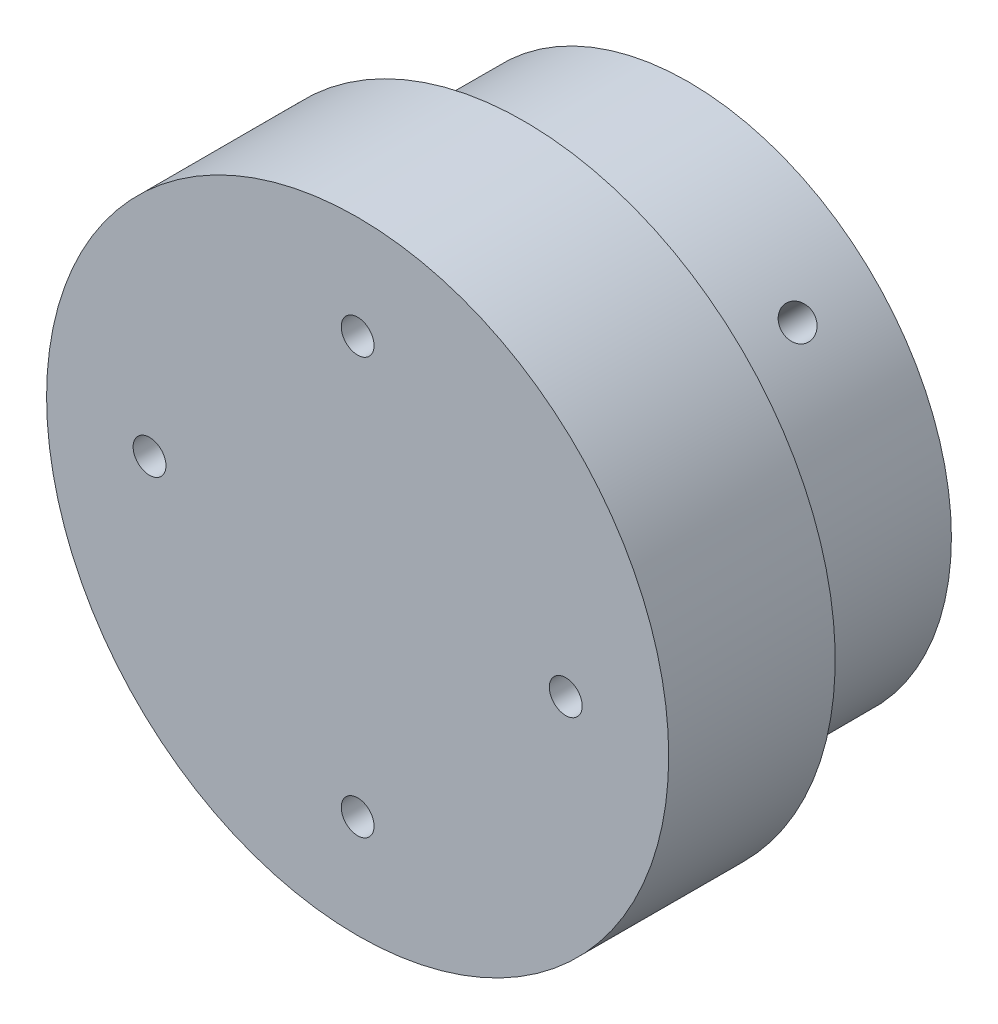
ISO-10303-21;
HEADER;
FILE_DESCRIPTION(('STEP AP214'),'2;1');
FILE_NAME('part.step','',(''),(''),'','','');
FILE_SCHEMA(('AUTOMOTIVE_DESIGN { 1 0 10303 214 1 1 1 1 }'));
ENDSEC;
DATA;
#1=APPLICATION_CONTEXT('core data for automotive mechanical design processes');
#2=APPLICATION_PROTOCOL_DEFINITION('international standard','automotive_design',2000,#1);
#3=PRODUCT_CONTEXT('',#1,'mechanical');
#4=PRODUCT('Part','Part','',(#3));
#5=PRODUCT_RELATED_PRODUCT_CATEGORY('part','',(#4));
#6=PRODUCT_DEFINITION_FORMATION('','',#4);
#7=PRODUCT_DEFINITION_CONTEXT('part definition',#1,'design');
#8=PRODUCT_DEFINITION('design','',#6,#7);
#9=PRODUCT_DEFINITION_SHAPE('','',#8);
#10=(LENGTH_UNIT() NAMED_UNIT(*) SI_UNIT(.MILLI.,.METRE.));
#11=(NAMED_UNIT(*) PLANE_ANGLE_UNIT() SI_UNIT($,.RADIAN.));
#12=(NAMED_UNIT(*) SI_UNIT($,.STERADIAN.) SOLID_ANGLE_UNIT());
#13=UNCERTAINTY_MEASURE_WITH_UNIT(LENGTH_MEASURE(1.E-05),#10,'distance_accuracy_value','');
#14=(GEOMETRIC_REPRESENTATION_CONTEXT(3) GLOBAL_UNCERTAINTY_ASSIGNED_CONTEXT((#13)) GLOBAL_UNIT_ASSIGNED_CONTEXT((#10,
#11,#12)) REPRESENTATION_CONTEXT('',''));
#15=CARTESIAN_POINT('',(0.,0.,0.));
#16=DIRECTION('',(0.,0.,1.));
#17=DIRECTION('',(1.,0.,0.));
#18=AXIS2_PLACEMENT_3D('',#15,#16,#17);
#19=CARTESIAN_POINT('',(-35.3482679915155,35.3482679915155,29.5));
#20=DIRECTION('',(0.707106781186547,-0.707106781186548,0.));
#21=DIRECTION('',(0.707106781186548,0.707106781186547,0.));
#22=AXIS2_PLACEMENT_3D('',#19,#20,#21);
#23=CYLINDRICAL_SURFACE('',#22,1.45);
#24=CARTESIAN_POINT('',(0.,0.,29.5));
#25=DIRECTION('',(0.,-1.,0.));
#26=DIRECTION('',(1.,0.,0.));
#27=AXIS2_PLACEMENT_3D('',#24,#25,#26);
#28=ELLIPSE('',#27,2.05060966544099,1.45);
#29=CARTESIAN_POINT('',(0.,0.,28.05));
#30=VERTEX_POINT('',#29);
#31=CARTESIAN_POINT('',(0.,0.,30.95));
#32=VERTEX_POINT('',#31);
#33=EDGE_CURVE('E11',#30,#32,#28,.F.);
#34=ORIENTED_EDGE('',*,*,#33,.F.);
#35=CARTESIAN_POINT('',(0.,0.,29.5));
#36=DIRECTION('',(1.,0.,0.));
#37=DIRECTION('',(0.,-1.,0.));
#38=AXIS2_PLACEMENT_3D('',#35,#36,#37);
#39=ELLIPSE('',#38,2.05060966544099,1.45);
#40=EDGE_CURVE('E56',#32,#30,#39,.F.);
#41=ORIENTED_EDGE('',*,*,#40,.F.);
#42=EDGE_LOOP('',(#34,#41));
#43=FACE_BOUND('',#42,.T.);
#44=CARTESIAN_POINT('',(-15.9213408530782,17.9719505185192,29.5));
#45=CARTESIAN_POINT('',(-15.9213438010672,17.9719484002794,29.4186325818246));
#46=CARTESIAN_POINT('',(-15.9264962267636,17.967387460958,29.3372080554519));
#47=CARTESIAN_POINT('',(-15.946952102721,17.949233922941,29.1766069473451));
#48=CARTESIAN_POINT('',(-15.962267395074,17.9356307879627,29.0974331005423));
#49=CARTESIAN_POINT('',(-16.0025350961888,17.8997121251281,28.9436829511586));
#50=CARTESIAN_POINT('',(-16.0274824500426,17.8774011670726,28.8691042608046));
#51=CARTESIAN_POINT('',(-16.0861869781197,17.8245964782,28.7266342596429));
#52=CARTESIAN_POINT('',(-16.1199421235813,17.7941046316999,28.6587414137907));
#53=CARTESIAN_POINT('',(-16.1952189946783,17.7256189298053,28.5314547893875));
#54=CARTESIAN_POINT('',(-16.2367503339505,17.6876157849923,28.4720716935363));
#55=CARTESIAN_POINT('',(-16.3262310506674,17.6050554563663,28.3635816052567));
#56=CARTESIAN_POINT('',(-16.3741806946131,17.5604980003974,28.3144750397479));
#57=CARTESIAN_POINT('',(-16.4750373146231,17.4659102678427,28.2278998278234));
#58=CARTESIAN_POINT('',(-16.5279479708209,17.4158759237599,28.1904399113545));
#59=CARTESIAN_POINT('',(-16.6370745670026,17.3116589738842,28.1282772682949));
#60=CARTESIAN_POINT('',(-16.693290473513,17.2574764101004,28.103574412533));
#61=CARTESIAN_POINT('',(-16.8072729074734,17.1464863438389,28.0676564564509));
#62=CARTESIAN_POINT('',(-16.8650374397458,17.0896821566872,28.0564247807902));
#63=CARTESIAN_POINT('',(-16.9804993843659,16.9749628155967,28.0477168301126));
#64=CARTESIAN_POINT('',(-17.0381967974215,16.9170476734911,28.0502404086663));
#65=CARTESIAN_POINT('',(-17.1518170307891,16.8018395328288,28.0689576432536));
#66=CARTESIAN_POINT('',(-17.2077420673121,16.7445458214039,28.0851334670956));
#67=CARTESIAN_POINT('',(-17.3163688673369,16.6321850576514,28.130668353174));
#68=CARTESIAN_POINT('',(-17.3690706127956,16.5771180177886,28.1600274891989));
#69=CARTESIAN_POINT('',(-17.4698936246552,16.4708315535866,28.2311158194772));
#70=CARTESIAN_POINT('',(-17.5180118684502,16.4196146728767,28.2728531029444));
#71=CARTESIAN_POINT('',(-17.6084019828673,16.3226431898506,28.3675070705062));
#72=CARTESIAN_POINT('',(-17.6506737922036,16.2768886447944,28.4204238717766));
#73=CARTESIAN_POINT('',(-17.728387969767,16.1922103398775,28.5360354914925));
#74=CARTESIAN_POINT('',(-17.7638193265244,16.1532976025101,28.5987457863907));
#75=CARTESIAN_POINT('',(-17.8269115180946,16.0836420467869,28.7321100289775));
#76=CARTESIAN_POINT('',(-17.8545723500283,16.052899231458,28.8027639796092));
#77=CARTESIAN_POINT('',(-17.9014677422684,16.0005872703053,28.950019738176));
#78=CARTESIAN_POINT('',(-17.9207018670189,15.9790185986721,29.0266218533163));
#79=CARTESIAN_POINT('',(-17.9502894963452,15.9457739397189,29.1835950011974));
#80=CARTESIAN_POINT('',(-17.9606430984301,15.9340978437774,29.2639659925452));
#81=CARTESIAN_POINT('',(-17.9722189128575,15.921040323758,29.4260595835387));
#82=CARTESIAN_POINT('',(-17.9734555183299,15.9196426729638,29.507779848526));
#83=CARTESIAN_POINT('',(-17.9668066294231,15.9271461253071,29.6703716839974));
#84=CARTESIAN_POINT('',(-17.9589211793165,15.9360471784613,29.7512432585985));
#85=CARTESIAN_POINT('',(-17.9342210822051,15.963839006287,29.9097809135391));
#86=CARTESIAN_POINT('',(-17.9174130833934,15.9827223431127,29.9874493341754));
#87=CARTESIAN_POINT('',(-17.875264318905,16.0298477565126,30.1374481678848));
#88=CARTESIAN_POINT('',(-17.8499234809842,16.0580899123242,30.2097785357563));
#89=CARTESIAN_POINT('',(-17.7912691398583,16.1230503494629,30.3471475532723));
#90=CARTESIAN_POINT('',(-17.7579456866175,16.1597792071108,30.4121769527669));
#91=CARTESIAN_POINT('',(-17.6841423442399,16.2405108535972,30.5330049293201));
#92=CARTESIAN_POINT('',(-17.6436623895195,16.284513709096,30.5888034217756));
#93=CARTESIAN_POINT('',(-17.5564834370166,16.3784643207338,30.689658734264));
#94=CARTESIAN_POINT('',(-17.5097764522372,16.4284197028908,30.7347015480797));
#95=CARTESIAN_POINT('',(-17.4113690659702,16.5326785145308,30.8126710766736));
#96=CARTESIAN_POINT('',(-17.359668693624,16.5869819186386,30.8455978621552));
#97=CARTESIAN_POINT('',(-17.2526680317938,16.6982482355269,30.8983762771956));
#98=CARTESIAN_POINT('',(-17.1973702159161,16.7552093134235,30.9182367888707));
#99=CARTESIAN_POINT('',(-17.0846455488973,16.8701352216355,30.9443479606186));
#100=CARTESIAN_POINT('',(-17.0272187170602,16.9281000428473,30.9505987440619));
#101=CARTESIAN_POINT('',(-16.911941574047,17.0432672942241,30.9493118355297));
#102=CARTESIAN_POINT('',(-16.8540920822994,17.100470790923,30.9417960722226));
#103=CARTESIAN_POINT('',(-16.7395490606259,17.2126123518179,30.9132348565855));
#104=CARTESIAN_POINT('',(-16.6828555327626,17.2675504119721,30.8921893801177));
#105=CARTESIAN_POINT('',(-16.5723050321137,17.3736778544196,30.8371710144449));
#106=CARTESIAN_POINT('',(-16.5184480479569,17.424867251741,30.8031981770679));
#107=CARTESIAN_POINT('',(-16.4152046976265,17.5221629058617,30.7232926102475));
#108=CARTESIAN_POINT('',(-16.3658182116334,17.5682692989045,30.6773602014761));
#109=CARTESIAN_POINT('',(-16.272974142349,17.6543034876627,30.5747586571684));
#110=CARTESIAN_POINT('',(-16.2295254317822,17.6942220486943,30.5180737497339));
#111=CARTESIAN_POINT('',(-16.1500097416167,17.7668284427883,30.3955959375687));
#112=CARTESIAN_POINT('',(-16.1139445729238,17.7995145021477,30.3298008050587));
#113=CARTESIAN_POINT('',(-16.0503370757225,17.8568928609587,30.1908993670064));
#114=CARTESIAN_POINT('',(-16.022804930387,17.881575610999,30.1177844627173));
#115=CARTESIAN_POINT('',(-15.9772533066241,17.922288326594,29.966434667418));
#116=CARTESIAN_POINT('',(-15.9592226694167,17.9383284427482,29.8882059042073));
#117=CARTESIAN_POINT('',(-15.9379667517518,17.9572110695948,29.7579142925672));
#118=CARTESIAN_POINT('',(-15.9317412036074,17.9627323526496,29.7066939786173));
#119=CARTESIAN_POINT('',(-15.9234273178427,17.9701027495188,29.6036568361823));
#120=CARTESIAN_POINT('',(-15.9213389748845,17.9719518680713,29.5518400084668));
#121=CARTESIAN_POINT('',(-15.9213408530782,17.9719505185192,29.5));
#122=B_SPLINE_CURVE_WITH_KNOTS('',3,(#44,#45,#46,#47,#48,#49,#50,#51,#52,#53,#54,#55,#56,#57,
#58,#59,#60,#61,#62,#63,#64,#65,#66,#67,#68,#69,#70,#71,#72,#73,#74,#75,#76,#77,#78,#79,#80,#81,
#82,#83,#84,#85,#86,#87,#88,#89,#90,#91,#92,#93,#94,#95,#96,#97,#98,#99,#100,#101,#102,#103,
#104,#105,#106,#107,#108,#109,#110,#111,#112,#113,#114,#115,#116,#117,#118,#119,#120,#121),
.UNSPECIFIED.,.T.,.F.,(4,2,2,2,2,2,2,2,2,2,2,2,2,2,2,2,2,2,2,2,2,2,2,2,2,2,2,2,2,2,2,2,2,2,2,2,
2,2,4),(0.,0.243913008457292,0.488110732281312,0.732180474898035,0.976194048730028,
1.22051131038443,1.46483871973577,1.70934882982762,1.95385646409207,2.19806293924066,
2.44226681473198,2.68615221052426,2.93003897138618,3.1740854666326,3.41813451992342,
3.66257321589487,3.90701200243294,4.15146342192313,4.39591215727462,4.6399748951851,
4.88403644857587,5.12791640636447,5.37179842904202,5.61598603810134,5.86017588506435,
6.10468200668958,6.34918670147079,6.59352501604898,6.83786111571998,7.08180835196461,
7.32575602342902,7.56970271687741,7.81364287005537,8.05794364397297,8.3023042641163,
8.54695538730675,8.79131854286453,8.94671819817978,9.10211765298784),.UNSPECIFIED.);
#123=CARTESIAN_POINT('',(-15.9213408530782,17.9719505185192,29.5));
#124=VERTEX_POINT('',#123);
#125=EDGE_CURVE('E76',#124,#124,#122,.T.);
#126=ORIENTED_EDGE('',*,*,#125,.T.);
#127=EDGE_LOOP('',(#126));
#128=FACE_BOUND('',#127,.T.);
#129=ADVANCED_FACE('F41',(#43,#128),#23,.F.);
#130=CARTESIAN_POINT('',(0.,0.,38.5));
#131=DIRECTION('',(0.,0.,-1.));
#132=DIRECTION('',(-1.,0.,0.));
#133=AXIS2_PLACEMENT_3D('',#130,#131,#132);
#134=CYLINDRICAL_SURFACE('',#133,24.01);
#135=CARTESIAN_POINT('',(17.9719505185192,15.9213408530782,29.5));
#136=CARTESIAN_POINT('',(17.9719484002794,15.9213438010672,29.5813674181753));
#137=CARTESIAN_POINT('',(17.967387460958,15.9264962267636,29.6627919445481));
#138=CARTESIAN_POINT('',(17.949233922941,15.946952102721,29.8233930526549));
#139=CARTESIAN_POINT('',(17.9356307879627,15.962267395074,29.9025668994577));
#140=CARTESIAN_POINT('',(17.8997121251281,16.0025350961888,30.0563170488414));
#141=CARTESIAN_POINT('',(17.8774011670726,16.0274824500426,30.1308957391954));
#142=CARTESIAN_POINT('',(17.8245964782,16.0861869781197,30.2733657403571));
#143=CARTESIAN_POINT('',(17.7941046316999,16.1199421235813,30.3412585862093));
#144=CARTESIAN_POINT('',(17.7256189298053,16.1952189946783,30.4685452106125));
#145=CARTESIAN_POINT('',(17.6876157849923,16.2367503339505,30.5279283064637));
#146=CARTESIAN_POINT('',(17.6050554563663,16.3262310506674,30.6364183947433));
#147=CARTESIAN_POINT('',(17.5604980003974,16.3741806946131,30.6855249602521));
#148=CARTESIAN_POINT('',(17.4659102678427,16.4750373146231,30.7721001721766));
#149=CARTESIAN_POINT('',(17.4158759237599,16.5279479708209,30.8095600886454));
#150=CARTESIAN_POINT('',(17.3116589738842,16.6370745670026,30.8717227317051));
#151=CARTESIAN_POINT('',(17.2574764101004,16.693290473513,30.896425587467));
#152=CARTESIAN_POINT('',(17.146486343839,16.8072729074734,30.9323435435491));
#153=CARTESIAN_POINT('',(17.0896821566872,16.8650374397458,30.9435752192098));
#154=CARTESIAN_POINT('',(16.9749628155967,16.9804993843659,30.9522831698874));
#155=CARTESIAN_POINT('',(16.9170476734911,17.0381967974215,30.9497595913337));
#156=CARTESIAN_POINT('',(16.8018395328288,17.1518170307891,30.9310423567463));
#157=CARTESIAN_POINT('',(16.7445458214039,17.2077420673121,30.9148665329044));
#158=CARTESIAN_POINT('',(16.6321850576514,17.3163688673369,30.869331646826));
#159=CARTESIAN_POINT('',(16.5771180177886,17.3690706127956,30.8399725108011));
#160=CARTESIAN_POINT('',(16.4708315535866,17.4698936246552,30.7688841805227));
#161=CARTESIAN_POINT('',(16.4196146728767,17.5180118684502,30.7271468970556));
#162=CARTESIAN_POINT('',(16.3226431898506,17.6084019828673,30.6324929294937));
#163=CARTESIAN_POINT('',(16.2768886447944,17.6506737922036,30.5795761282234));
#164=CARTESIAN_POINT('',(16.1922103398775,17.728387969767,30.4639645085075));
#165=CARTESIAN_POINT('',(16.1532976025101,17.7638193265244,30.4012542136093));
#166=CARTESIAN_POINT('',(16.0836420467869,17.8269115180946,30.2678899710225));
#167=CARTESIAN_POINT('',(16.052899231458,17.8545723500283,30.1972360203908));
#168=CARTESIAN_POINT('',(16.0005872703053,17.9014677422684,30.049980261824));
#169=CARTESIAN_POINT('',(15.9790185986721,17.9207018670189,29.9733781466837));
#170=CARTESIAN_POINT('',(15.9457739397189,17.9502894963452,29.8164049988026));
#171=CARTESIAN_POINT('',(15.9340978437774,17.9606430984301,29.7360340074548));
#172=CARTESIAN_POINT('',(15.921040323758,17.9722189128575,29.5739404164613));
#173=CARTESIAN_POINT('',(15.9196426729638,17.9734555183299,29.492220151474));
#174=CARTESIAN_POINT('',(15.9271461253071,17.9668066294231,29.3296283160026));
#175=CARTESIAN_POINT('',(15.9360471784614,17.9589211793165,29.2487567414014));
#176=CARTESIAN_POINT('',(15.963839006287,17.9342210822051,29.0902190864609));
#177=CARTESIAN_POINT('',(15.9827223431127,17.9174130833934,29.0125506658246));
#178=CARTESIAN_POINT('',(16.0298477565126,17.875264318905,28.8625518321152));
#179=CARTESIAN_POINT('',(16.0580899123242,17.8499234809842,28.7902214642437));
#180=CARTESIAN_POINT('',(16.1230503494629,17.7912691398583,28.6528524467277));
#181=CARTESIAN_POINT('',(16.1597792071108,17.7579456866175,28.5878230472331));
#182=CARTESIAN_POINT('',(16.2405108535972,17.6841423442399,28.4669950706799));
#183=CARTESIAN_POINT('',(16.284513709096,17.6436623895195,28.4111965782244));
#184=CARTESIAN_POINT('',(16.3784643207338,17.5564834370166,28.3103412657359));
#185=CARTESIAN_POINT('',(16.4284197028908,17.5097764522372,28.2652984519203));
#186=CARTESIAN_POINT('',(16.5326785145308,17.4113690659702,28.1873289233264));
#187=CARTESIAN_POINT('',(16.5869819186386,17.359668693624,28.1544021378447));
#188=CARTESIAN_POINT('',(16.6982482355269,17.2526680317938,28.1016237228044));
#189=CARTESIAN_POINT('',(16.7552093134235,17.1973702159161,28.0817632111293));
#190=CARTESIAN_POINT('',(16.8701352216355,17.0846455488973,28.0556520393814));
#191=CARTESIAN_POINT('',(16.9281000428473,17.0272187170602,28.0494012559381));
#192=CARTESIAN_POINT('',(17.0432672942241,16.911941574047,28.0506881644703));
#193=CARTESIAN_POINT('',(17.100470790923,16.8540920822994,28.0582039277774));
#194=CARTESIAN_POINT('',(17.2126123518179,16.7395490606259,28.0867651434144));
#195=CARTESIAN_POINT('',(17.2675504119721,16.6828555327626,28.1078106198823));
#196=CARTESIAN_POINT('',(17.3736778544196,16.5723050321137,28.1628289855551));
#197=CARTESIAN_POINT('',(17.424867251741,16.5184480479569,28.1968018229321));
#198=CARTESIAN_POINT('',(17.5221629058617,16.4152046976265,28.2767073897525));
#199=CARTESIAN_POINT('',(17.5682692989045,16.3658182116334,28.3226397985238));
#200=CARTESIAN_POINT('',(17.6543034876627,16.272974142349,28.4252413428316));
#201=CARTESIAN_POINT('',(17.6942220486943,16.2295254317822,28.4819262502661));
#202=CARTESIAN_POINT('',(17.7668284427883,16.1500097416167,28.6044040624312));
#203=CARTESIAN_POINT('',(17.7995145021477,16.1139445729238,28.6701991949413));
#204=CARTESIAN_POINT('',(17.8568928609587,16.0503370757225,28.8091006329936));
#205=CARTESIAN_POINT('',(17.881575610999,16.022804930387,28.8822155372827));
#206=CARTESIAN_POINT('',(17.922288326594,15.9772533066241,29.033565332582));
#207=CARTESIAN_POINT('',(17.9383284427482,15.9592226694167,29.1117940957927));
#208=CARTESIAN_POINT('',(17.9572110695948,15.9379667517518,29.2420857074328));
#209=CARTESIAN_POINT('',(17.9627323526496,15.9317412036074,29.2933060213826));
#210=CARTESIAN_POINT('',(17.9701027495188,15.9234273178427,29.3963431638177));
#211=CARTESIAN_POINT('',(17.9719518680713,15.9213389748845,29.4481599915332));
#212=CARTESIAN_POINT('',(17.9719505185192,15.9213408530782,29.5));
#213=B_SPLINE_CURVE_WITH_KNOTS('',3,(#135,#136,#137,#138,#139,#140,#141,#142,#143,#144,#145,
#146,#147,#148,#149,#150,#151,#152,#153,#154,#155,#156,#157,#158,#159,#160,#161,#162,#163,#164,
#165,#166,#167,#168,#169,#170,#171,#172,#173,#174,#175,#176,#177,#178,#179,#180,#181,#182,#183,
#184,#185,#186,#187,#188,#189,#190,#191,#192,#193,#194,#195,#196,#197,#198,#199,#200,#201,#202,
#203,#204,#205,#206,#207,#208,#209,#210,#211,#212),.UNSPECIFIED.,.T.,.F.,(4,2,2,2,2,2,2,2,2,2,2,
2,2,2,2,2,2,2,2,2,2,2,2,2,2,2,2,2,2,2,2,2,2,2,2,2,2,2,4),(0.,0.243913008457293,
0.488110732281312,0.732180474898033,0.976194048730025,1.22051131038443,1.46483871973577,
1.70934882982761,1.95385646409206,2.19806293924066,2.44226681473198,2.68615221052425,
2.93003897138617,3.1740854666326,3.41813451992342,3.66257321589486,3.90701200243293,
4.15146342192312,4.3959121572746,4.63997489518509,4.88403644857586,5.12791640636446,
5.37179842904201,5.61598603810133,5.86017588506434,6.10468200668957,6.34918670147078,
6.59352501604897,6.83786111571997,7.08180835196459,7.32575602342901,7.56970271687739,
7.81364287005535,8.05794364397296,8.30230426411629,8.54695538730674,8.79131854286452,
8.94671819817977,9.10211765298782),.UNSPECIFIED.);
#214=CARTESIAN_POINT('',(17.9719505185192,15.9213408530782,29.5));
#215=VERTEX_POINT('',#214);
#216=EDGE_CURVE('E84',#215,#215,#213,.T.);
#217=ORIENTED_EDGE('',*,*,#216,.T.);
#218=EDGE_LOOP('',(#217));
#219=FACE_BOUND('',#218,.T.);
#220=CARTESIAN_POINT('',(-15.9213408530782,-17.9719505185192,29.5));
#221=CARTESIAN_POINT('',(-15.9213438010672,-17.9719484002794,29.4186325818246));
#222=CARTESIAN_POINT('',(-15.9264962267636,-17.967387460958,29.3372080554519));
#223=CARTESIAN_POINT('',(-15.946952102721,-17.949233922941,29.1766069473451));
#224=CARTESIAN_POINT('',(-15.962267395074,-17.9356307879627,29.0974331005423));
#225=CARTESIAN_POINT('',(-16.0025350961888,-17.8997121251281,28.9436829511586));
#226=CARTESIAN_POINT('',(-16.0274824500426,-17.8774011670726,28.8691042608046));
#227=CARTESIAN_POINT('',(-16.0861869781197,-17.8245964782,28.7266342596429));
#228=CARTESIAN_POINT('',(-16.1199421235813,-17.7941046316999,28.6587414137907));
#229=CARTESIAN_POINT('',(-16.1952189946783,-17.7256189298053,28.5314547893875));
#230=CARTESIAN_POINT('',(-16.2367503339505,-17.6876157849923,28.4720716935363));
#231=CARTESIAN_POINT('',(-16.3262310506674,-17.6050554563663,28.3635816052567));
#232=CARTESIAN_POINT('',(-16.3741806946131,-17.5604980003974,28.3144750397479));
#233=CARTESIAN_POINT('',(-16.4750373146231,-17.4659102678427,28.2278998278234));
#234=CARTESIAN_POINT('',(-16.5279479708209,-17.4158759237599,28.1904399113545));
#235=CARTESIAN_POINT('',(-16.6370745670026,-17.3116589738842,28.1282772682949));
#236=CARTESIAN_POINT('',(-16.693290473513,-17.2574764101004,28.103574412533));
#237=CARTESIAN_POINT('',(-16.8072729074734,-17.146486343839,28.0676564564509));
#238=CARTESIAN_POINT('',(-16.8650374397458,-17.0896821566872,28.0564247807902));
#239=CARTESIAN_POINT('',(-16.9804993843659,-16.9749628155968,28.0477168301126));
#240=CARTESIAN_POINT('',(-17.0381967974215,-16.9170476734911,28.0502404086663));
#241=CARTESIAN_POINT('',(-17.1518170307891,-16.8018395328288,28.0689576432536));
#242=CARTESIAN_POINT('',(-17.2077420673121,-16.7445458214039,28.0851334670956));
#243=CARTESIAN_POINT('',(-17.3163688673369,-16.6321850576514,28.130668353174));
#244=CARTESIAN_POINT('',(-17.3690706127956,-16.5771180177886,28.1600274891989));
#245=CARTESIAN_POINT('',(-17.4698936246552,-16.4708315535866,28.2311158194772));
#246=CARTESIAN_POINT('',(-17.5180118684502,-16.4196146728767,28.2728531029444));
#247=CARTESIAN_POINT('',(-17.6084019828673,-16.3226431898506,28.3675070705062));
#248=CARTESIAN_POINT('',(-17.6506737922036,-16.2768886447944,28.4204238717766));
#249=CARTESIAN_POINT('',(-17.728387969767,-16.1922103398775,28.5360354914925));
#250=CARTESIAN_POINT('',(-17.7638193265244,-16.1532976025101,28.5987457863907));
#251=CARTESIAN_POINT('',(-17.8269115180946,-16.0836420467869,28.7321100289775));
#252=CARTESIAN_POINT('',(-17.8545723500283,-16.052899231458,28.8027639796092));
#253=CARTESIAN_POINT('',(-17.9014677422684,-16.0005872703053,28.950019738176));
#254=CARTESIAN_POINT('',(-17.9207018670189,-15.9790185986721,29.0266218533163));
#255=CARTESIAN_POINT('',(-17.9502894963452,-15.9457739397189,29.1835950011974));
#256=CARTESIAN_POINT('',(-17.9606430984301,-15.9340978437774,29.2639659925452));
#257=CARTESIAN_POINT('',(-17.9722189128575,-15.921040323758,29.4260595835387));
#258=CARTESIAN_POINT('',(-17.9734555183299,-15.9196426729638,29.507779848526));
#259=CARTESIAN_POINT('',(-17.9668066294231,-15.9271461253071,29.6703716839974));
#260=CARTESIAN_POINT('',(-17.9589211793166,-15.9360471784613,29.7512432585985));
#261=CARTESIAN_POINT('',(-17.9342210822051,-15.963839006287,29.9097809135391));
#262=CARTESIAN_POINT('',(-17.9174130833934,-15.9827223431127,29.9874493341754));
#263=CARTESIAN_POINT('',(-17.875264318905,-16.0298477565126,30.1374481678848));
#264=CARTESIAN_POINT('',(-17.8499234809842,-16.0580899123242,30.2097785357562));
#265=CARTESIAN_POINT('',(-17.7912691398583,-16.1230503494629,30.3471475532722));
#266=CARTESIAN_POINT('',(-17.7579456866175,-16.1597792071108,30.4121769527669));
#267=CARTESIAN_POINT('',(-17.6841423442399,-16.2405108535972,30.5330049293201));
#268=CARTESIAN_POINT('',(-17.6436623895195,-16.284513709096,30.5888034217756));
#269=CARTESIAN_POINT('',(-17.5564834370166,-16.3784643207338,30.689658734264));
#270=CARTESIAN_POINT('',(-17.5097764522372,-16.4284197028908,30.7347015480797));
#271=CARTESIAN_POINT('',(-17.4113690659703,-16.5326785145308,30.8126710766736));
#272=CARTESIAN_POINT('',(-17.359668693624,-16.5869819186386,30.8455978621552));
#273=CARTESIAN_POINT('',(-17.2526680317938,-16.6982482355269,30.8983762771955));
#274=CARTESIAN_POINT('',(-17.1973702159161,-16.7552093134235,30.9182367888707));
#275=CARTESIAN_POINT('',(-17.0846455488973,-16.8701352216355,30.9443479606186));
#276=CARTESIAN_POINT('',(-17.0272187170602,-16.9281000428473,30.9505987440619));
#277=CARTESIAN_POINT('',(-16.911941574047,-17.0432672942241,30.9493118355297));
#278=CARTESIAN_POINT('',(-16.8540920822994,-17.100470790923,30.9417960722225));
#279=CARTESIAN_POINT('',(-16.7395490606259,-17.2126123518179,30.9132348565855));
#280=CARTESIAN_POINT('',(-16.6828555327626,-17.2675504119721,30.8921893801177));
#281=CARTESIAN_POINT('',(-16.5723050321137,-17.3736778544196,30.8371710144449));
#282=CARTESIAN_POINT('',(-16.5184480479569,-17.424867251741,30.8031981770679));
#283=CARTESIAN_POINT('',(-16.4152046976265,-17.5221629058617,30.7232926102475));
#284=CARTESIAN_POINT('',(-16.3658182116334,-17.5682692989045,30.6773602014761));
#285=CARTESIAN_POINT('',(-16.272974142349,-17.6543034876627,30.5747586571684));
#286=CARTESIAN_POINT('',(-16.2295254317822,-17.6942220486943,30.5180737497339));
#287=CARTESIAN_POINT('',(-16.1500097416167,-17.7668284427882,30.3955959375687));
#288=CARTESIAN_POINT('',(-16.1139445729238,-17.7995145021477,30.3298008050587));
#289=CARTESIAN_POINT('',(-16.0503370757225,-17.8568928609587,30.1908993670064));
#290=CARTESIAN_POINT('',(-16.022804930387,-17.881575610999,30.1177844627173));
#291=CARTESIAN_POINT('',(-15.9772533066241,-17.922288326594,29.966434667418));
#292=CARTESIAN_POINT('',(-15.9592226694167,-17.9383284427482,29.8882059042073));
#293=CARTESIAN_POINT('',(-15.9379667517518,-17.9572110695948,29.7579142925672));
#294=CARTESIAN_POINT('',(-15.9317412036074,-17.9627323526496,29.7066939786173));
#295=CARTESIAN_POINT('',(-15.9234273178427,-17.9701027495188,29.6036568361823));
#296=CARTESIAN_POINT('',(-15.9213389748845,-17.9719518680713,29.5518400084668));
#297=CARTESIAN_POINT('',(-15.9213408530782,-17.9719505185192,29.5));
#298=B_SPLINE_CURVE_WITH_KNOTS('',3,(#220,#221,#222,#223,#224,#225,#226,#227,#228,#229,#230,
#231,#232,#233,#234,#235,#236,#237,#238,#239,#240,#241,#242,#243,#244,#245,#246,#247,#248,#249,
#250,#251,#252,#253,#254,#255,#256,#257,#258,#259,#260,#261,#262,#263,#264,#265,#266,#267,#268,
#269,#270,#271,#272,#273,#274,#275,#276,#277,#278,#279,#280,#281,#282,#283,#284,#285,#286,#287,
#288,#289,#290,#291,#292,#293,#294,#295,#296,#297),.UNSPECIFIED.,.T.,.F.,(4,2,2,2,2,2,2,2,2,2,2,
2,2,2,2,2,2,2,2,2,2,2,2,2,2,2,2,2,2,2,2,2,2,2,2,2,2,2,4),(0.,0.24391300845729,0.488110732281308,
0.732180474898027,0.97619404873002,1.22051131038443,1.46483871973577,1.70934882982761,
1.95385646409206,2.19806293924065,2.44226681473197,2.68615221052425,2.93003897138617,
3.1740854666326,3.41813451992342,3.66257321589486,3.90701200243293,4.15146342192312,
4.3959121572746,4.63997489518508,4.88403644857585,5.12791640636445,5.37179842904201,
5.61598603810132,5.86017588506433,6.10468200668956,6.34918670147077,6.59352501604896,
6.83786111571996,7.08180835196459,7.325756023429,7.56970271687739,7.81364287005535,
8.05794364397295,8.30230426411628,8.54695538730673,8.79131854286451,8.94671819817976,
9.10211765298782),.UNSPECIFIED.);
#299=CARTESIAN_POINT('',(-15.9213408530782,-17.9719505185192,29.5));
#300=VERTEX_POINT('',#299);
#301=EDGE_CURVE('E174',#300,#300,#298,.T.);
#302=ORIENTED_EDGE('',*,*,#301,.T.);
#303=EDGE_LOOP('',(#302));
#304=FACE_BOUND('',#303,.T.);
#305=CARTESIAN_POINT('',(0.,0.,37.5));
#306=DIRECTION('',(0.,0.,-1.));
#307=DIRECTION('',(-1.,0.,0.));
#308=AXIS2_PLACEMENT_3D('',#305,#306,#307);
#309=CIRCLE('',#308,24.01);
#310=CARTESIAN_POINT('',(-24.01,0.,37.5));
#311=VERTEX_POINT('',#310);
#312=EDGE_CURVE('E178',#311,#311,#309,.T.);
#313=ORIENTED_EDGE('',*,*,#312,.T.);
#314=EDGE_LOOP('',(#313));
#315=FACE_BOUND('',#314,.T.);
#316=CARTESIAN_POINT('',(0.,0.,22.5));
#317=DIRECTION('',(0.,0.,-1.));
#318=DIRECTION('',(-1.,0.,0.));
#319=AXIS2_PLACEMENT_3D('',#316,#317,#318);
#320=CIRCLE('',#319,24.01);
#321=CARTESIAN_POINT('',(-24.01,0.,22.5));
#322=VERTEX_POINT('',#321);
#323=EDGE_CURVE('E182',#322,#322,#320,.T.);
#324=ORIENTED_EDGE('',*,*,#323,.F.);
#325=EDGE_LOOP('',(#324));
#326=FACE_BOUND('',#325,.T.);
#327=CARTESIAN_POINT('',(17.9719505185192,-15.9213408530782,29.5));
#328=CARTESIAN_POINT('',(17.9719484002794,-15.9213438010672,29.5813674181754));
#329=CARTESIAN_POINT('',(17.967387460958,-15.9264962267636,29.6627919445481));
#330=CARTESIAN_POINT('',(17.949233922941,-15.946952102721,29.8233930526549));
#331=CARTESIAN_POINT('',(17.9356307879627,-15.962267395074,29.9025668994577));
#332=CARTESIAN_POINT('',(17.8997121251281,-16.0025350961888,30.0563170488414));
#333=CARTESIAN_POINT('',(17.8774011670726,-16.0274824500426,30.1308957391954));
#334=CARTESIAN_POINT('',(17.8245964782,-16.0861869781197,30.2733657403571));
#335=CARTESIAN_POINT('',(17.7941046316999,-16.1199421235813,30.3412585862093));
#336=CARTESIAN_POINT('',(17.7256189298053,-16.1952189946783,30.4685452106125));
#337=CARTESIAN_POINT('',(17.6876157849923,-16.2367503339505,30.5279283064637));
#338=CARTESIAN_POINT('',(17.6050554563663,-16.3262310506674,30.6364183947433));
#339=CARTESIAN_POINT('',(17.5604980003974,-16.3741806946131,30.6855249602521));
#340=CARTESIAN_POINT('',(17.4659102678427,-16.4750373146232,30.7721001721766));
#341=CARTESIAN_POINT('',(17.4158759237599,-16.5279479708209,30.8095600886454));
#342=CARTESIAN_POINT('',(17.3116589738842,-16.6370745670026,30.8717227317051));
#343=CARTESIAN_POINT('',(17.2574764101004,-16.693290473513,30.896425587467));
#344=CARTESIAN_POINT('',(17.1464863438389,-16.8072729074734,30.9323435435491));
#345=CARTESIAN_POINT('',(17.0896821566872,-16.8650374397459,30.9435752192098));
#346=CARTESIAN_POINT('',(16.9749628155967,-16.9804993843659,30.9522831698874));
#347=CARTESIAN_POINT('',(16.9170476734911,-17.0381967974215,30.9497595913337));
#348=CARTESIAN_POINT('',(16.8018395328288,-17.1518170307891,30.9310423567463));
#349=CARTESIAN_POINT('',(16.7445458214039,-17.2077420673122,30.9148665329044));
#350=CARTESIAN_POINT('',(16.6321850576514,-17.3163688673369,30.869331646826));
#351=CARTESIAN_POINT('',(16.5771180177886,-17.3690706127956,30.8399725108011));
#352=CARTESIAN_POINT('',(16.4708315535866,-17.4698936246552,30.7688841805228));
#353=CARTESIAN_POINT('',(16.4196146728767,-17.5180118684502,30.7271468970556));
#354=CARTESIAN_POINT('',(16.3226431898506,-17.6084019828673,30.6324929294938));
#355=CARTESIAN_POINT('',(16.2768886447944,-17.6506737922036,30.5795761282234));
#356=CARTESIAN_POINT('',(16.1922103398775,-17.728387969767,30.4639645085075));
#357=CARTESIAN_POINT('',(16.1532976025101,-17.7638193265244,30.4012542136093));
#358=CARTESIAN_POINT('',(16.0836420467869,-17.8269115180946,30.2678899710225));
#359=CARTESIAN_POINT('',(16.052899231458,-17.8545723500284,30.1972360203908));
#360=CARTESIAN_POINT('',(16.0005872703053,-17.9014677422684,30.049980261824));
#361=CARTESIAN_POINT('',(15.9790185986721,-17.9207018670189,29.9733781466837));
#362=CARTESIAN_POINT('',(15.9457739397189,-17.9502894963452,29.8164049988026));
#363=CARTESIAN_POINT('',(15.9340978437774,-17.9606430984302,29.7360340074548));
#364=CARTESIAN_POINT('',(15.921040323758,-17.9722189128575,29.5739404164613));
#365=CARTESIAN_POINT('',(15.9196426729638,-17.9734555183299,29.492220151474));
#366=CARTESIAN_POINT('',(15.9271461253071,-17.9668066294231,29.3296283160026));
#367=CARTESIAN_POINT('',(15.9360471784613,-17.9589211793165,29.2487567414014));
#368=CARTESIAN_POINT('',(15.963839006287,-17.9342210822051,29.0902190864609));
#369=CARTESIAN_POINT('',(15.9827223431127,-17.9174130833934,29.0125506658246));
#370=CARTESIAN_POINT('',(16.0298477565126,-17.875264318905,28.8625518321152));
#371=CARTESIAN_POINT('',(16.0580899123242,-17.8499234809842,28.7902214642437));
#372=CARTESIAN_POINT('',(16.1230503494629,-17.7912691398583,28.6528524467277));
#373=CARTESIAN_POINT('',(16.1597792071108,-17.7579456866175,28.5878230472331));
#374=CARTESIAN_POINT('',(16.2405108535972,-17.6841423442399,28.4669950706799));
#375=CARTESIAN_POINT('',(16.284513709096,-17.6436623895195,28.4111965782244));
#376=CARTESIAN_POINT('',(16.3784643207338,-17.5564834370166,28.3103412657359));
#377=CARTESIAN_POINT('',(16.4284197028908,-17.5097764522372,28.2652984519203));
#378=CARTESIAN_POINT('',(16.5326785145308,-17.4113690659703,28.1873289233264));
#379=CARTESIAN_POINT('',(16.5869819186386,-17.359668693624,28.1544021378448));
#380=CARTESIAN_POINT('',(16.6982482355269,-17.2526680317938,28.1016237228044));
#381=CARTESIAN_POINT('',(16.7552093134235,-17.1973702159161,28.0817632111293));
#382=CARTESIAN_POINT('',(16.8701352216355,-17.0846455488973,28.0556520393814));
#383=CARTESIAN_POINT('',(16.9281000428473,-17.0272187170602,28.0494012559381));
#384=CARTESIAN_POINT('',(17.0432672942241,-16.911941574047,28.0506881644703));
#385=CARTESIAN_POINT('',(17.100470790923,-16.8540920822994,28.0582039277774));
#386=CARTESIAN_POINT('',(17.2126123518179,-16.7395490606259,28.0867651434145));
#387=CARTESIAN_POINT('',(17.2675504119721,-16.6828555327626,28.1078106198823));
#388=CARTESIAN_POINT('',(17.3736778544196,-16.5723050321137,28.1628289855551));
#389=CARTESIAN_POINT('',(17.424867251741,-16.5184480479569,28.1968018229321));
#390=CARTESIAN_POINT('',(17.5221629058617,-16.4152046976265,28.2767073897525));
#391=CARTESIAN_POINT('',(17.5682692989045,-16.3658182116334,28.3226397985238));
#392=CARTESIAN_POINT('',(17.6543034876627,-16.272974142349,28.4252413428316));
#393=CARTESIAN_POINT('',(17.6942220486943,-16.2295254317822,28.4819262502661));
#394=CARTESIAN_POINT('',(17.7668284427882,-16.1500097416167,28.6044040624312));
#395=CARTESIAN_POINT('',(17.7995145021477,-16.1139445729238,28.6701991949413));
#396=CARTESIAN_POINT('',(17.8568928609587,-16.0503370757225,28.8091006329936));
#397=CARTESIAN_POINT('',(17.881575610999,-16.022804930387,28.8822155372827));
#398=CARTESIAN_POINT('',(17.922288326594,-15.9772533066241,29.033565332582));
#399=CARTESIAN_POINT('',(17.9383284427482,-15.9592226694167,29.1117940957927));
#400=CARTESIAN_POINT('',(17.9572110695948,-15.9379667517518,29.2420857074328));
#401=CARTESIAN_POINT('',(17.9627323526496,-15.9317412036074,29.2933060213826));
#402=CARTESIAN_POINT('',(17.9701027495188,-15.9234273178427,29.3963431638177));
#403=CARTESIAN_POINT('',(17.9719518680713,-15.9213389748845,29.4481599915332));
#404=CARTESIAN_POINT('',(17.9719505185192,-15.9213408530782,29.5));
#405=B_SPLINE_CURVE_WITH_KNOTS('',3,(#327,#328,#329,#330,#331,#332,#333,#334,#335,#336,#337,
#338,#339,#340,#341,#342,#343,#344,#345,#346,#347,#348,#349,#350,#351,#352,#353,#354,#355,#356,
#357,#358,#359,#360,#361,#362,#363,#364,#365,#366,#367,#368,#369,#370,#371,#372,#373,#374,#375,
#376,#377,#378,#379,#380,#381,#382,#383,#384,#385,#386,#387,#388,#389,#390,#391,#392,#393,#394,
#395,#396,#397,#398,#399,#400,#401,#402,#403,#404),.UNSPECIFIED.,.T.,.F.,(4,2,2,2,2,2,2,2,2,2,2,
2,2,2,2,2,2,2,2,2,2,2,2,2,2,2,2,2,2,2,2,2,2,2,2,2,2,2,4),(0.,0.243913008457292,
0.488110732281312,0.732180474898037,0.976194048730031,1.22051131038443,1.46483871973578,
1.70934882982761,1.95385646409207,2.19806293924066,2.44226681473198,2.68615221052426,
2.93003897138617,3.1740854666326,3.41813451992342,3.66257321589488,3.90701200243294,
4.15146342192313,4.39591215727462,4.6399748951851,4.88403644857587,5.12791640636447,
5.37179842904202,5.61598603810133,5.86017588506435,6.10468200668958,6.34918670147079,
6.59352501604898,6.83786111571998,7.08180835196461,7.32575602342902,7.56970271687741,
7.81364287005537,8.05794364397297,8.3023042641163,8.54695538730675,8.79131854286452,
8.94671819817978,9.10211765298784),.UNSPECIFIED.);
#406=CARTESIAN_POINT('',(17.9719505185192,-15.9213408530782,29.5));
#407=VERTEX_POINT('',#406);
#408=EDGE_CURVE('E70',#407,#407,#405,.T.);
#409=ORIENTED_EDGE('',*,*,#408,.F.);
#410=EDGE_LOOP('',(#409));
#411=FACE_BOUND('',#410,.T.);
#412=ORIENTED_EDGE('',*,*,#125,.F.);
#413=EDGE_LOOP('',(#412));
#414=FACE_BOUND('',#413,.T.);
#415=ADVANCED_FACE('F43',(#219,#304,#315,#326,#411,#414),#134,.T.);
#416=CARTESIAN_POINT('',(0.,-19.,15.5));
#417=DIRECTION('',(0.,0.,1.));
#418=DIRECTION('',(1.,0.,0.));
#419=AXIS2_PLACEMENT_3D('',#416,#417,#418);
#420=CYLINDRICAL_SURFACE('',#419,4.);
#421=CARTESIAN_POINT('',(0.,-19.,37.5));
#422=DIRECTION('',(0.,0.,-1.));
#423=DIRECTION('',(-1.,0.,0.));
#424=AXIS2_PLACEMENT_3D('',#421,#422,#423);
#425=CIRCLE('',#424,4.);
#426=CARTESIAN_POINT('',(-4.,-19.,37.5));
#427=VERTEX_POINT('',#426);
#428=EDGE_CURVE('E231',#427,#427,#425,.T.);
#429=ORIENTED_EDGE('',*,*,#428,.F.);
#430=EDGE_LOOP('',(#429));
#431=FACE_BOUND('',#430,.T.);
#432=CARTESIAN_POINT('',(0.,-19.,22.5));
#433=DIRECTION('',(0.,0.,-1.));
#434=DIRECTION('',(-1.,0.,0.));
#435=AXIS2_PLACEMENT_3D('',#432,#433,#434);
#436=CIRCLE('',#435,4.);
#437=CARTESIAN_POINT('',(-4.,-19.,22.5));
#438=VERTEX_POINT('',#437);
#439=EDGE_CURVE('E220',#438,#438,#436,.T.);
#440=ORIENTED_EDGE('',*,*,#439,.T.);
#441=EDGE_LOOP('',(#440));
#442=FACE_BOUND('',#441,.T.);
#443=ADVANCED_FACE('F104',(#431,#442),#420,.F.);
#444=CARTESIAN_POINT('',(0.,19.,15.5));
#445=DIRECTION('',(0.,0.,1.));
#446=DIRECTION('',(1.,0.,0.));
#447=AXIS2_PLACEMENT_3D('',#444,#445,#446);
#448=CYLINDRICAL_SURFACE('',#447,4.);
#449=CARTESIAN_POINT('',(0.,19.,37.5));
#450=DIRECTION('',(0.,0.,-1.));
#451=DIRECTION('',(-1.,0.,0.));
#452=AXIS2_PLACEMENT_3D('',#449,#450,#451);
#453=CIRCLE('',#452,4.);
#454=CARTESIAN_POINT('',(-4.,19.,37.5));
#455=VERTEX_POINT('',#454);
#456=EDGE_CURVE('E232',#455,#455,#453,.T.);
#457=ORIENTED_EDGE('',*,*,#456,.F.);
#458=EDGE_LOOP('',(#457));
#459=FACE_BOUND('',#458,.T.);
#460=CARTESIAN_POINT('',(0.,19.,22.5));
#461=DIRECTION('',(0.,0.,-1.));
#462=DIRECTION('',(-1.,0.,0.));
#463=AXIS2_PLACEMENT_3D('',#460,#461,#462);
#464=CIRCLE('',#463,4.);
#465=CARTESIAN_POINT('',(-4.,19.,22.5));
#466=VERTEX_POINT('',#465);
#467=EDGE_CURVE('E215',#466,#466,#464,.T.);
#468=ORIENTED_EDGE('',*,*,#467,.T.);
#469=EDGE_LOOP('',(#468));
#470=FACE_BOUND('',#469,.T.);
#471=ADVANCED_FACE('F100',(#459,#470),#448,.F.);
#472=CARTESIAN_POINT('',(19.,0.,15.5));
#473=DIRECTION('',(0.,0.,1.));
#474=DIRECTION('',(1.,0.,0.));
#475=AXIS2_PLACEMENT_3D('',#472,#473,#474);
#476=CYLINDRICAL_SURFACE('',#475,4.);
#477=CARTESIAN_POINT('',(19.,0.,37.5));
#478=DIRECTION('',(0.,0.,-1.));
#479=DIRECTION('',(-1.,0.,0.));
#480=AXIS2_PLACEMENT_3D('',#477,#478,#479);
#481=CIRCLE('',#480,4.);
#482=CARTESIAN_POINT('',(15.,0.,37.5));
#483=VERTEX_POINT('',#482);
#484=EDGE_CURVE('E236',#483,#483,#481,.T.);
#485=ORIENTED_EDGE('',*,*,#484,.F.);
#486=EDGE_LOOP('',(#485));
#487=FACE_BOUND('',#486,.T.);
#488=CARTESIAN_POINT('',(19.,0.,22.5));
#489=DIRECTION('',(0.,0.,-1.));
#490=DIRECTION('',(-1.,0.,0.));
#491=AXIS2_PLACEMENT_3D('',#488,#489,#490);
#492=CIRCLE('',#491,4.);
#493=CARTESIAN_POINT('',(15.,0.,22.5));
#494=VERTEX_POINT('',#493);
#495=EDGE_CURVE('E211',#494,#494,#492,.T.);
#496=ORIENTED_EDGE('',*,*,#495,.T.);
#497=EDGE_LOOP('',(#496));
#498=FACE_BOUND('',#497,.T.);
#499=ADVANCED_FACE('F103',(#487,#498),#476,.F.);
#500=CARTESIAN_POINT('',(-19.,0.,15.5));
#501=DIRECTION('',(0.,0.,1.));
#502=DIRECTION('',(1.,0.,0.));
#503=AXIS2_PLACEMENT_3D('',#500,#501,#502);
#504=CYLINDRICAL_SURFACE('',#503,4.);
#505=CARTESIAN_POINT('',(-19.,0.,37.5));
#506=DIRECTION('',(0.,0.,-1.));
#507=DIRECTION('',(-1.,0.,0.));
#508=AXIS2_PLACEMENT_3D('',#505,#506,#507);
#509=CIRCLE('',#508,4.);
#510=CARTESIAN_POINT('',(-23.,0.,37.5));
#511=VERTEX_POINT('',#510);
#512=EDGE_CURVE('E239',#511,#511,#509,.T.);
#513=ORIENTED_EDGE('',*,*,#512,.F.);
#514=EDGE_LOOP('',(#513));
#515=FACE_BOUND('',#514,.T.);
#516=CARTESIAN_POINT('',(-19.,0.,22.5));
#517=DIRECTION('',(0.,0.,-1.));
#518=DIRECTION('',(-1.,0.,0.));
#519=AXIS2_PLACEMENT_3D('',#516,#517,#518);
#520=CIRCLE('',#519,4.);
#521=CARTESIAN_POINT('',(-23.,0.,22.5));
#522=VERTEX_POINT('',#521);
#523=EDGE_CURVE('E83',#522,#522,#520,.T.);
#524=ORIENTED_EDGE('',*,*,#523,.T.);
#525=EDGE_LOOP('',(#524));
#526=FACE_BOUND('',#525,.T.);
#527=ADVANCED_FACE('F108',(#515,#526),#504,.F.);
#528=CARTESIAN_POINT('',(0.,-19.,19.7));
#529=DIRECTION('',(0.,0.,1.));
#530=DIRECTION('',(1.,0.,0.));
#531=AXIS2_PLACEMENT_3D('',#528,#529,#530);
#532=CYLINDRICAL_SURFACE('',#531,1.5);
#533=CARTESIAN_POINT('',(0.,-19.,37.5));
#534=DIRECTION('',(0.,0.,-1.));
#535=DIRECTION('',(-1.,0.,0.));
#536=AXIS2_PLACEMENT_3D('',#533,#534,#535);
#537=CIRCLE('',#536,1.5);
#538=CARTESIAN_POINT('',(-1.5,-19.,37.5));
#539=VERTEX_POINT('',#538);
#540=EDGE_CURVE('E208',#539,#539,#537,.F.);
#541=ORIENTED_EDGE('',*,*,#540,.F.);
#542=EDGE_LOOP('',(#541));
#543=FACE_BOUND('',#542,.T.);
#544=CARTESIAN_POINT('',(0.,-19.,52.7));
#545=DIRECTION('',(0.,0.,1.));
#546=DIRECTION('',(1.,0.,0.));
#547=AXIS2_PLACEMENT_3D('',#544,#545,#546);
#548=CIRCLE('',#547,1.5);
#549=CARTESIAN_POINT('',(1.5,-19.,52.7));
#550=VERTEX_POINT('',#549);
#551=EDGE_CURVE('E197',#550,#550,#548,.T.);
#552=ORIENTED_EDGE('',*,*,#551,.T.);
#553=EDGE_LOOP('',(#552));
#554=FACE_BOUND('',#553,.T.);
#555=ADVANCED_FACE('F112',(#543,#554),#532,.F.);
#556=CARTESIAN_POINT('',(0.,19.,19.7));
#557=DIRECTION('',(0.,0.,1.));
#558=DIRECTION('',(1.,0.,0.));
#559=AXIS2_PLACEMENT_3D('',#556,#557,#558);
#560=CYLINDRICAL_SURFACE('',#559,1.5);
#561=CARTESIAN_POINT('',(0.,19.,37.5));
#562=DIRECTION('',(0.,0.,-1.));
#563=DIRECTION('',(-1.,0.,0.));
#564=AXIS2_PLACEMENT_3D('',#561,#562,#563);
#565=CIRCLE('',#564,1.5);
#566=CARTESIAN_POINT('',(-1.5,19.,37.5));
#567=VERTEX_POINT('',#566);
#568=EDGE_CURVE('E205',#567,#567,#565,.F.);
#569=ORIENTED_EDGE('',*,*,#568,.F.);
#570=EDGE_LOOP('',(#569));
#571=FACE_BOUND('',#570,.T.);
#572=CARTESIAN_POINT('',(0.,19.,52.7));
#573=DIRECTION('',(0.,0.,1.));
#574=DIRECTION('',(1.,0.,0.));
#575=AXIS2_PLACEMENT_3D('',#572,#573,#574);
#576=CIRCLE('',#575,1.5);
#577=CARTESIAN_POINT('',(1.5,19.,52.7));
#578=VERTEX_POINT('',#577);
#579=EDGE_CURVE('E248',#578,#578,#576,.T.);
#580=ORIENTED_EDGE('',*,*,#579,.T.);
#581=EDGE_LOOP('',(#580));
#582=FACE_BOUND('',#581,.T.);
#583=ADVANCED_FACE('F145',(#571,#582),#560,.F.);
#584=CARTESIAN_POINT('',(19.,0.,19.7));
#585=DIRECTION('',(0.,0.,1.));
#586=DIRECTION('',(1.,0.,0.));
#587=AXIS2_PLACEMENT_3D('',#584,#585,#586);
#588=CYLINDRICAL_SURFACE('',#587,1.5);
#589=CARTESIAN_POINT('',(19.,0.,37.5));
#590=DIRECTION('',(0.,0.,-1.));
#591=DIRECTION('',(-1.,0.,0.));
#592=AXIS2_PLACEMENT_3D('',#589,#590,#591);
#593=CIRCLE('',#592,1.5);
#594=CARTESIAN_POINT('',(17.5,0.,37.5));
#595=VERTEX_POINT('',#594);
#596=EDGE_CURVE('E202',#595,#595,#593,.F.);
#597=ORIENTED_EDGE('',*,*,#596,.F.);
#598=EDGE_LOOP('',(#597));
#599=FACE_BOUND('',#598,.T.);
#600=CARTESIAN_POINT('',(19.,0.,52.7));
#601=DIRECTION('',(0.,0.,1.));
#602=DIRECTION('',(1.,0.,0.));
#603=AXIS2_PLACEMENT_3D('',#600,#601,#602);
#604=CIRCLE('',#603,1.5);
#605=CARTESIAN_POINT('',(20.5,0.,52.7));
#606=VERTEX_POINT('',#605);
#607=EDGE_CURVE('E193',#606,#606,#604,.T.);
#608=ORIENTED_EDGE('',*,*,#607,.T.);
#609=EDGE_LOOP('',(#608));
#610=FACE_BOUND('',#609,.T.);
#611=ADVANCED_FACE('F141',(#599,#610),#588,.F.);
#612=CARTESIAN_POINT('',(-19.,0.,19.7));
#613=DIRECTION('',(0.,0.,1.));
#614=DIRECTION('',(1.,0.,0.));
#615=AXIS2_PLACEMENT_3D('',#612,#613,#614);
#616=CYLINDRICAL_SURFACE('',#615,1.5);
#617=CARTESIAN_POINT('',(-19.,0.,37.5));
#618=DIRECTION('',(0.,0.,-1.));
#619=DIRECTION('',(-1.,0.,0.));
#620=AXIS2_PLACEMENT_3D('',#617,#618,#619);
#621=CIRCLE('',#620,1.5);
#622=CARTESIAN_POINT('',(-20.5,0.,37.5));
#623=VERTEX_POINT('',#622);
#624=EDGE_CURVE('E199',#623,#623,#621,.F.);
#625=ORIENTED_EDGE('',*,*,#624,.F.);
#626=EDGE_LOOP('',(#625));
#627=FACE_BOUND('',#626,.T.);
#628=CARTESIAN_POINT('',(-19.,0.,52.7));
#629=DIRECTION('',(0.,0.,1.));
#630=DIRECTION('',(1.,0.,0.));
#631=AXIS2_PLACEMENT_3D('',#628,#629,#630);
#632=CIRCLE('',#631,1.5);
#633=CARTESIAN_POINT('',(-17.5,0.,52.7));
#634=VERTEX_POINT('',#633);
#635=EDGE_CURVE('E189',#634,#634,#632,.T.);
#636=ORIENTED_EDGE('',*,*,#635,.T.);
#637=EDGE_LOOP('',(#636));
#638=FACE_BOUND('',#637,.T.);
#639=ADVANCED_FACE('F137',(#627,#638),#616,.F.);
#640=CARTESIAN_POINT('',(0.,0.,52.7));
#641=DIRECTION('',(0.,0.,-1.));
#642=DIRECTION('',(-1.,0.,0.));
#643=AXIS2_PLACEMENT_3D('',#640,#641,#642);
#644=CYLINDRICAL_SURFACE('',#643,28.4);
#645=CARTESIAN_POINT('',(0.,0.,52.7));
#646=DIRECTION('',(0.,0.,1.));
#647=DIRECTION('',(1.,0.,0.));
#648=AXIS2_PLACEMENT_3D('',#645,#646,#647);
#649=CIRCLE('',#648,28.4);
#650=CARTESIAN_POINT('',(28.4,0.,52.7));
#651=VERTEX_POINT('',#650);
#652=EDGE_CURVE('E187',#651,#651,#649,.T.);
#653=ORIENTED_EDGE('',*,*,#652,.F.);
#654=EDGE_LOOP('',(#653));
#655=FACE_BOUND('',#654,.T.);
#656=CARTESIAN_POINT('',(0.,0.,37.5));
#657=DIRECTION('',(0.,0.,-1.));
#658=DIRECTION('',(-1.,0.,0.));
#659=AXIS2_PLACEMENT_3D('',#656,#657,#658);
#660=CIRCLE('',#659,28.4);
#661=CARTESIAN_POINT('',(-28.4,0.,37.5));
#662=VERTEX_POINT('',#661);
#663=EDGE_CURVE('E235',#662,#662,#660,.T.);
#664=ORIENTED_EDGE('',*,*,#663,.F.);
#665=EDGE_LOOP('',(#664));
#666=FACE_BOUND('',#665,.T.);
#667=ADVANCED_FACE('F140',(#655,#666),#644,.T.);
#668=CARTESIAN_POINT('',(0.,0.,52.7));
#669=DIRECTION('',(0.,0.,1.));
#670=DIRECTION('',(1.,0.,0.));
#671=AXIS2_PLACEMENT_3D('',#668,#669,#670);
#672=PLANE('',#671);
#673=ORIENTED_EDGE('',*,*,#635,.F.);
#674=EDGE_LOOP('',(#673));
#675=FACE_BOUND('',#674,.T.);
#676=ORIENTED_EDGE('',*,*,#607,.F.);
#677=EDGE_LOOP('',(#676));
#678=FACE_BOUND('',#677,.T.);
#679=ORIENTED_EDGE('',*,*,#579,.F.);
#680=EDGE_LOOP('',(#679));
#681=FACE_BOUND('',#680,.T.);
#682=ORIENTED_EDGE('',*,*,#551,.F.);
#683=EDGE_LOOP('',(#682));
#684=FACE_BOUND('',#683,.T.);
#685=ORIENTED_EDGE('',*,*,#652,.T.);
#686=EDGE_LOOP('',(#685));
#687=FACE_BOUND('',#686,.T.);
#688=ADVANCED_FACE('F132',(#675,#678,#681,#684,#687),#672,.T.);
#689=CARTESIAN_POINT('',(-19.,0.,37.5));
#690=DIRECTION('',(0.,0.,-1.));
#691=DIRECTION('',(-1.,0.,0.));
#692=AXIS2_PLACEMENT_3D('',#689,#690,#691);
#693=PLANE('',#692);
#694=ORIENTED_EDGE('',*,*,#624,.T.);
#695=EDGE_LOOP('',(#694));
#696=FACE_BOUND('',#695,.T.);
#697=ORIENTED_EDGE('',*,*,#512,.T.);
#698=EDGE_LOOP('',(#697));
#699=FACE_BOUND('',#698,.T.);
#700=ADVANCED_FACE('F125',(#696,#699),#693,.T.);
#701=CARTESIAN_POINT('',(19.,0.,37.5));
#702=DIRECTION('',(0.,0.,-1.));
#703=DIRECTION('',(-1.,0.,0.));
#704=AXIS2_PLACEMENT_3D('',#701,#702,#703);
#705=PLANE('',#704);
#706=ORIENTED_EDGE('',*,*,#596,.T.);
#707=EDGE_LOOP('',(#706));
#708=FACE_BOUND('',#707,.T.);
#709=ORIENTED_EDGE('',*,*,#484,.T.);
#710=EDGE_LOOP('',(#709));
#711=FACE_BOUND('',#710,.T.);
#712=ADVANCED_FACE('F121',(#708,#711),#705,.T.);
#713=CARTESIAN_POINT('',(0.,19.,37.5));
#714=DIRECTION('',(0.,0.,-1.));
#715=DIRECTION('',(-1.,0.,0.));
#716=AXIS2_PLACEMENT_3D('',#713,#714,#715);
#717=PLANE('',#716);
#718=ORIENTED_EDGE('',*,*,#568,.T.);
#719=EDGE_LOOP('',(#718));
#720=FACE_BOUND('',#719,.T.);
#721=ORIENTED_EDGE('',*,*,#456,.T.);
#722=EDGE_LOOP('',(#721));
#723=FACE_BOUND('',#722,.T.);
#724=ADVANCED_FACE('F124',(#720,#723),#717,.T.);
#725=CARTESIAN_POINT('',(0.,-19.,37.5));
#726=DIRECTION('',(0.,0.,-1.));
#727=DIRECTION('',(-1.,0.,0.));
#728=AXIS2_PLACEMENT_3D('',#725,#726,#727);
#729=PLANE('',#728);
#730=ORIENTED_EDGE('',*,*,#540,.T.);
#731=EDGE_LOOP('',(#730));
#732=FACE_BOUND('',#731,.T.);
#733=ORIENTED_EDGE('',*,*,#428,.T.);
#734=EDGE_LOOP('',(#733));
#735=FACE_BOUND('',#734,.T.);
#736=ADVANCED_FACE('F119',(#732,#735),#729,.T.);
#737=CARTESIAN_POINT('',(0.,0.,37.5));
#738=DIRECTION('',(0.,0.,-1.));
#739=DIRECTION('',(-1.,0.,0.));
#740=AXIS2_PLACEMENT_3D('',#737,#738,#739);
#741=PLANE('',#740);
#742=ORIENTED_EDGE('',*,*,#312,.F.);
#743=EDGE_LOOP('',(#742));
#744=FACE_BOUND('',#743,.T.);
#745=ORIENTED_EDGE('',*,*,#663,.T.);
#746=EDGE_LOOP('',(#745));
#747=FACE_BOUND('',#746,.T.);
#748=ADVANCED_FACE('F98',(#744,#747),#741,.T.);
#749=CARTESIAN_POINT('',(0.,74.,22.5));
#750=DIRECTION('',(0.,0.,-1.));
#751=DIRECTION('',(-1.,0.,0.));
#752=AXIS2_PLACEMENT_3D('',#749,#750,#751);
#753=PLANE('',#752);
#754=ORIENTED_EDGE('',*,*,#523,.F.);
#755=EDGE_LOOP('',(#754));
#756=FACE_BOUND('',#755,.T.);
#757=ORIENTED_EDGE('',*,*,#495,.F.);
#758=EDGE_LOOP('',(#757));
#759=FACE_BOUND('',#758,.T.);
#760=ORIENTED_EDGE('',*,*,#467,.F.);
#761=EDGE_LOOP('',(#760));
#762=FACE_BOUND('',#761,.T.);
#763=ORIENTED_EDGE('',*,*,#439,.F.);
#764=EDGE_LOOP('',(#763));
#765=FACE_BOUND('',#764,.T.);
#766=ORIENTED_EDGE('',*,*,#323,.T.);
#767=EDGE_LOOP('',(#766));
#768=FACE_BOUND('',#767,.T.);
#769=ADVANCED_FACE('F93',(#756,#759,#762,#765,#768),#753,.T.);
#770=CARTESIAN_POINT('',(0.,0.,29.5));
#771=DIRECTION('',(0.,-1.,0.));
#772=DIRECTION('',(1.,0.,0.));
#773=AXIS2_PLACEMENT_3D('',#770,#771,#772);
#774=ELLIPSE('',#773,2.05060966544099,1.45);
#775=EDGE_CURVE('E50',#30,#32,#774,.T.);
#776=ORIENTED_EDGE('',*,*,#775,.F.);
#777=CARTESIAN_POINT('',(0.,0.,29.5));
#778=DIRECTION('',(1.,0.,0.));
#779=DIRECTION('',(0.,-1.,0.));
#780=AXIS2_PLACEMENT_3D('',#777,#778,#779);
#781=ELLIPSE('',#780,2.05060966544099,1.45);
#782=EDGE_CURVE('E61',#32,#30,#781,.T.);
#783=ORIENTED_EDGE('',*,*,#782,.F.);
#784=EDGE_LOOP('',(#776,#783));
#785=FACE_BOUND('',#784,.T.);
#786=ORIENTED_EDGE('',*,*,#408,.T.);
#787=EDGE_LOOP('',(#786));
#788=FACE_BOUND('',#787,.T.);
#789=ADVANCED_FACE('F73',(#785,#788),#23,.F.);
#790=CARTESIAN_POINT('',(35.3482679915155,35.3482679915155,29.5));
#791=DIRECTION('',(-0.707106781186547,-0.707106781186547,0.));
#792=DIRECTION('',(0.707106781186548,-0.707106781186548,0.));
#793=AXIS2_PLACEMENT_3D('',#790,#791,#792);
#794=CYLINDRICAL_SURFACE('',#793,1.45);
#795=ORIENTED_EDGE('',*,*,#775,.T.);
#796=ORIENTED_EDGE('',*,*,#40,.T.);
#797=EDGE_LOOP('',(#795,#796));
#798=FACE_BOUND('',#797,.T.);
#799=ORIENTED_EDGE('',*,*,#216,.F.);
#800=EDGE_LOOP('',(#799));
#801=FACE_BOUND('',#800,.T.);
#802=ADVANCED_FACE('F68',(#798,#801),#794,.F.);
#803=ORIENTED_EDGE('',*,*,#33,.T.);
#804=ORIENTED_EDGE('',*,*,#782,.T.);
#805=EDGE_LOOP('',(#803,#804));
#806=FACE_BOUND('',#805,.T.);
#807=ORIENTED_EDGE('',*,*,#301,.F.);
#808=EDGE_LOOP('',(#807));
#809=FACE_BOUND('',#808,.T.);
#810=ADVANCED_FACE('F62',(#806,#809),#794,.F.);
#811=CLOSED_SHELL('',(#129,#415,#443,#471,#499,#527,#555,#583,#611,#639,#667,#688,#700,#712,
#724,#736,#748,#769,#789,#802,#810));
#812=MANIFOLD_SOLID_BREP('B2',#811);
#813=ADVANCED_BREP_SHAPE_REPRESENTATION('',(#18,#812),#14);
#814=SHAPE_DEFINITION_REPRESENTATION(#9,#813);
ENDSEC;
END-ISO-10303-21;
